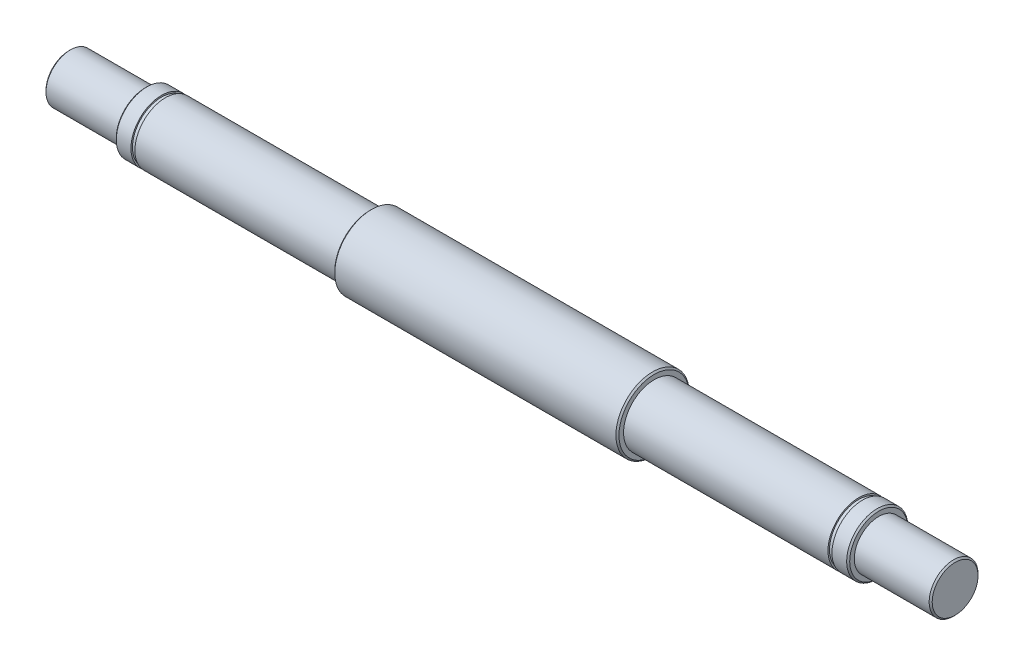
ISO-10303-21;
HEADER;
FILE_DESCRIPTION(('STEP AP214'),'2;1');
FILE_NAME('part.step','',(''),(''),'','','');
FILE_SCHEMA(('AUTOMOTIVE_DESIGN { 1 0 10303 214 1 1 1 1 }'));
ENDSEC;
DATA;
#1=APPLICATION_CONTEXT('core data for automotive mechanical design processes');
#2=APPLICATION_PROTOCOL_DEFINITION('international standard','automotive_design',2000,#1);
#3=PRODUCT_CONTEXT('',#1,'mechanical');
#4=PRODUCT('Part','Part','',(#3));
#5=PRODUCT_RELATED_PRODUCT_CATEGORY('part','',(#4));
#6=PRODUCT_DEFINITION_FORMATION('','',#4);
#7=PRODUCT_DEFINITION_CONTEXT('part definition',#1,'design');
#8=PRODUCT_DEFINITION('design','',#6,#7);
#9=PRODUCT_DEFINITION_SHAPE('','',#8);
#10=(LENGTH_UNIT() NAMED_UNIT(*) SI_UNIT(.MILLI.,.METRE.));
#11=(NAMED_UNIT(*) PLANE_ANGLE_UNIT() SI_UNIT($,.RADIAN.));
#12=(NAMED_UNIT(*) SI_UNIT($,.STERADIAN.) SOLID_ANGLE_UNIT());
#13=UNCERTAINTY_MEASURE_WITH_UNIT(LENGTH_MEASURE(1.E-05),#10,'distance_accuracy_value','');
#14=(GEOMETRIC_REPRESENTATION_CONTEXT(3) GLOBAL_UNCERTAINTY_ASSIGNED_CONTEXT((#13)) GLOBAL_UNIT_ASSIGNED_CONTEXT((#10,
#11,#12)) REPRESENTATION_CONTEXT('',''));
#15=CARTESIAN_POINT('',(0.,0.,0.));
#16=DIRECTION('',(0.,0.,1.));
#17=DIRECTION('',(1.,0.,0.));
#18=AXIS2_PLACEMENT_3D('',#15,#16,#17);
#19=CARTESIAN_POINT('',(145.,0.,0.));
#20=DIRECTION('',(-1.,0.,0.));
#21=DIRECTION('',(0.,0.,1.));
#22=AXIS2_PLACEMENT_3D('',#19,#20,#21);
#23=PLANE('',#22);
#24=CARTESIAN_POINT('',(145.,0.,0.));
#25=DIRECTION('',(-1.,0.,0.));
#26=DIRECTION('',(0.,0.,1.));
#27=AXIS2_PLACEMENT_3D('',#24,#25,#26);
#28=CIRCLE('',#27,7.49999999999992);
#29=CARTESIAN_POINT('',(145.,0.,7.49999999999992));
#30=VERTEX_POINT('',#29);
#31=EDGE_CURVE('E64',#30,#30,#28,.F.);
#32=ORIENTED_EDGE('',*,*,#31,.T.);
#33=EDGE_LOOP('',(#32));
#34=FACE_BOUND('',#33,.T.);
#35=ADVANCED_FACE('F32',(#34),#23,.F.);
#36=CARTESIAN_POINT('',(-145.,0.,0.));
#37=DIRECTION('',(-1.,0.,0.));
#38=DIRECTION('',(0.,0.,1.));
#39=AXIS2_PLACEMENT_3D('',#36,#37,#38);
#40=CYLINDRICAL_SURFACE('',#39,8.);
#41=CARTESIAN_POINT('',(144.5,0.,0.));
#42=DIRECTION('',(-1.,0.,0.));
#43=DIRECTION('',(0.,0.,1.));
#44=AXIS2_PLACEMENT_3D('',#41,#42,#43);
#45=CIRCLE('',#44,8.);
#46=CARTESIAN_POINT('',(144.5,0.,8.));
#47=VERTEX_POINT('',#46);
#48=EDGE_CURVE('E67',#47,#47,#45,.T.);
#49=ORIENTED_EDGE('',*,*,#48,.T.);
#50=EDGE_LOOP('',(#49));
#51=FACE_BOUND('',#50,.T.);
#52=CARTESIAN_POINT('',(120.,0.,0.));
#53=DIRECTION('',(-1.,0.,0.));
#54=DIRECTION('',(0.,0.,1.));
#55=AXIS2_PLACEMENT_3D('',#52,#53,#54);
#56=CIRCLE('',#55,8.);
#57=CARTESIAN_POINT('',(120.,0.,8.));
#58=VERTEX_POINT('',#57);
#59=EDGE_CURVE('E76',#58,#58,#56,.T.);
#60=ORIENTED_EDGE('',*,*,#59,.F.);
#61=EDGE_LOOP('',(#60));
#62=FACE_BOUND('',#61,.T.);
#63=ADVANCED_FACE('F130',(#51,#62),#40,.T.);
#64=CARTESIAN_POINT('',(120.,0.,-8.));
#65=DIRECTION('',(-1.,0.,0.));
#66=DIRECTION('',(0.,0.,1.));
#67=AXIS2_PLACEMENT_3D('',#64,#65,#66);
#68=PLANE('',#67);
#69=CARTESIAN_POINT('',(120.,0.,0.));
#70=DIRECTION('',(-1.,0.,0.));
#71=DIRECTION('',(0.,0.,1.));
#72=AXIS2_PLACEMENT_3D('',#69,#70,#71);
#73=CIRCLE('',#72,9.50000000000004);
#74=CARTESIAN_POINT('',(120.,0.,9.50000000000004));
#75=VERTEX_POINT('',#74);
#76=EDGE_CURVE('E70',#75,#75,#73,.F.);
#77=ORIENTED_EDGE('',*,*,#76,.T.);
#78=EDGE_LOOP('',(#77));
#79=FACE_BOUND('',#78,.T.);
#80=ORIENTED_EDGE('',*,*,#59,.T.);
#81=EDGE_LOOP('',(#80));
#82=FACE_BOUND('',#81,.T.);
#83=ADVANCED_FACE('F136',(#79,#82),#68,.F.);
#84=CARTESIAN_POINT('',(-145.,0.,0.));
#85=DIRECTION('',(-1.,0.,0.));
#86=DIRECTION('',(0.,0.,1.));
#87=AXIS2_PLACEMENT_3D('',#84,#85,#86);
#88=CYLINDRICAL_SURFACE('',#87,10.);
#89=CARTESIAN_POINT('',(119.5,0.,0.));
#90=DIRECTION('',(-1.,0.,0.));
#91=DIRECTION('',(0.,0.,1.));
#92=AXIS2_PLACEMENT_3D('',#89,#90,#91);
#93=CIRCLE('',#92,10.);
#94=CARTESIAN_POINT('',(119.5,0.,10.));
#95=VERTEX_POINT('',#94);
#96=EDGE_CURVE('E73',#95,#95,#93,.T.);
#97=ORIENTED_EDGE('',*,*,#96,.T.);
#98=EDGE_LOOP('',(#97));
#99=FACE_BOUND('',#98,.T.);
#100=CARTESIAN_POINT('',(114.7,0.,0.));
#101=DIRECTION('',(-1.,0.,0.));
#102=DIRECTION('',(0.,0.,1.));
#103=AXIS2_PLACEMENT_3D('',#100,#101,#102);
#104=CIRCLE('',#103,10.);
#105=CARTESIAN_POINT('',(114.7,0.,10.));
#106=VERTEX_POINT('',#105);
#107=EDGE_CURVE('E79',#106,#106,#104,.T.);
#108=ORIENTED_EDGE('',*,*,#107,.F.);
#109=EDGE_LOOP('',(#108));
#110=FACE_BOUND('',#109,.T.);
#111=ADVANCED_FACE('F222',(#99,#110),#88,.T.);
#112=CARTESIAN_POINT('',(114.7,0.,-10.));
#113=DIRECTION('',(1.,0.,0.));
#114=DIRECTION('',(0.,0.,-1.));
#115=AXIS2_PLACEMENT_3D('',#112,#113,#114);
#116=PLANE('',#115);
#117=CARTESIAN_POINT('',(114.7,0.,0.));
#118=DIRECTION('',(-1.,0.,0.));
#119=DIRECTION('',(0.,0.,1.));
#120=AXIS2_PLACEMENT_3D('',#117,#118,#119);
#121=CIRCLE('',#120,9.5);
#122=CARTESIAN_POINT('',(114.7,0.,9.5));
#123=VERTEX_POINT('',#122);
#124=EDGE_CURVE('E82',#123,#123,#121,.T.);
#125=ORIENTED_EDGE('',*,*,#124,.F.);
#126=EDGE_LOOP('',(#125));
#127=FACE_BOUND('',#126,.T.);
#128=ORIENTED_EDGE('',*,*,#107,.T.);
#129=EDGE_LOOP('',(#128));
#130=FACE_BOUND('',#129,.T.);
#131=ADVANCED_FACE('F218',(#127,#130),#116,.F.);
#132=CARTESIAN_POINT('',(-145.,0.,0.));
#133=DIRECTION('',(-1.,0.,0.));
#134=DIRECTION('',(0.,0.,1.));
#135=AXIS2_PLACEMENT_3D('',#132,#133,#134);
#136=CYLINDRICAL_SURFACE('',#135,9.5);
#137=CARTESIAN_POINT('',(113.4,0.,0.));
#138=DIRECTION('',(-1.,0.,0.));
#139=DIRECTION('',(0.,0.,1.));
#140=AXIS2_PLACEMENT_3D('',#137,#138,#139);
#141=CIRCLE('',#140,9.5);
#142=CARTESIAN_POINT('',(113.4,0.,9.5));
#143=VERTEX_POINT('',#142);
#144=EDGE_CURVE('E85',#143,#143,#141,.T.);
#145=ORIENTED_EDGE('',*,*,#144,.F.);
#146=EDGE_LOOP('',(#145));
#147=FACE_BOUND('',#146,.T.);
#148=ORIENTED_EDGE('',*,*,#124,.T.);
#149=EDGE_LOOP('',(#148));
#150=FACE_BOUND('',#149,.T.);
#151=ADVANCED_FACE('F214',(#147,#150),#136,.T.);
#152=CARTESIAN_POINT('',(113.4,0.,-9.5));
#153=DIRECTION('',(-1.,0.,0.));
#154=DIRECTION('',(0.,0.,1.));
#155=AXIS2_PLACEMENT_3D('',#152,#153,#154);
#156=PLANE('',#155);
#157=CARTESIAN_POINT('',(113.4,0.,0.));
#158=DIRECTION('',(-1.,0.,0.));
#159=DIRECTION('',(0.,0.,1.));
#160=AXIS2_PLACEMENT_3D('',#157,#158,#159);
#161=CIRCLE('',#160,10.);
#162=CARTESIAN_POINT('',(113.4,0.,10.));
#163=VERTEX_POINT('',#162);
#164=EDGE_CURVE('E88',#163,#163,#161,.T.);
#165=ORIENTED_EDGE('',*,*,#164,.F.);
#166=EDGE_LOOP('',(#165));
#167=FACE_BOUND('',#166,.T.);
#168=ORIENTED_EDGE('',*,*,#144,.T.);
#169=EDGE_LOOP('',(#168));
#170=FACE_BOUND('',#169,.T.);
#171=ADVANCED_FACE('F210',(#167,#170),#156,.F.);
#172=CARTESIAN_POINT('',(-145.,0.,0.));
#173=DIRECTION('',(-1.,0.,0.));
#174=DIRECTION('',(0.,0.,1.));
#175=AXIS2_PLACEMENT_3D('',#172,#173,#174);
#176=CYLINDRICAL_SURFACE('',#175,10.);
#177=CARTESIAN_POINT('',(46.5,0.,0.));
#178=DIRECTION('',(-1.,0.,0.));
#179=DIRECTION('',(0.,0.,1.));
#180=AXIS2_PLACEMENT_3D('',#177,#178,#179);
#181=CIRCLE('',#180,10.);
#182=CARTESIAN_POINT('',(46.5,0.,10.));
#183=VERTEX_POINT('',#182);
#184=EDGE_CURVE('E91',#183,#183,#181,.T.);
#185=ORIENTED_EDGE('',*,*,#184,.F.);
#186=EDGE_LOOP('',(#185));
#187=FACE_BOUND('',#186,.T.);
#188=ORIENTED_EDGE('',*,*,#164,.T.);
#189=EDGE_LOOP('',(#188));
#190=FACE_BOUND('',#189,.T.);
#191=ADVANCED_FACE('F206',(#187,#190),#176,.T.);
#192=CARTESIAN_POINT('',(46.5,0.,-10.));
#193=DIRECTION('',(-1.,0.,0.));
#194=DIRECTION('',(0.,0.,1.));
#195=AXIS2_PLACEMENT_3D('',#192,#193,#194);
#196=PLANE('',#195);
#197=CARTESIAN_POINT('',(46.5,0.,0.));
#198=DIRECTION('',(-1.,0.,0.));
#199=DIRECTION('',(0.,0.,1.));
#200=AXIS2_PLACEMENT_3D('',#197,#198,#199);
#201=CIRCLE('',#200,11.5);
#202=CARTESIAN_POINT('',(46.5,0.,11.5));
#203=VERTEX_POINT('',#202);
#204=EDGE_CURVE('E55',#203,#203,#201,.F.);
#205=ORIENTED_EDGE('',*,*,#204,.T.);
#206=EDGE_LOOP('',(#205));
#207=FACE_BOUND('',#206,.T.);
#208=ORIENTED_EDGE('',*,*,#184,.T.);
#209=EDGE_LOOP('',(#208));
#210=FACE_BOUND('',#209,.T.);
#211=ADVANCED_FACE('F200',(#207,#210),#196,.F.);
#212=CARTESIAN_POINT('',(-145.,0.,0.));
#213=DIRECTION('',(-1.,0.,0.));
#214=DIRECTION('',(0.,0.,1.));
#215=AXIS2_PLACEMENT_3D('',#212,#213,#214);
#216=CYLINDRICAL_SURFACE('',#215,12.);
#217=CARTESIAN_POINT('',(46.,0.,0.));
#218=DIRECTION('',(-1.,0.,0.));
#219=DIRECTION('',(0.,0.,1.));
#220=AXIS2_PLACEMENT_3D('',#217,#218,#219);
#221=CIRCLE('',#220,12.);
#222=CARTESIAN_POINT('',(46.,0.,12.));
#223=VERTEX_POINT('',#222);
#224=EDGE_CURVE('E58',#223,#223,#221,.T.);
#225=ORIENTED_EDGE('',*,*,#224,.T.);
#226=EDGE_LOOP('',(#225));
#227=FACE_BOUND('',#226,.T.);
#228=CARTESIAN_POINT('',(-46.0000000000001,0.,0.));
#229=DIRECTION('',(1.,0.,0.));
#230=DIRECTION('',(0.,0.,-1.));
#231=AXIS2_PLACEMENT_3D('',#228,#229,#230);
#232=CIRCLE('',#231,12.);
#233=CARTESIAN_POINT('',(-46.0000000000001,0.,-12.));
#234=VERTEX_POINT('',#233);
#235=EDGE_CURVE('E61',#234,#234,#232,.T.);
#236=ORIENTED_EDGE('',*,*,#235,.T.);
#237=EDGE_LOOP('',(#236));
#238=FACE_BOUND('',#237,.T.);
#239=ADVANCED_FACE('F194',(#227,#238),#216,.T.);
#240=CARTESIAN_POINT('',(-46.5,0.,-10.));
#241=DIRECTION('',(1.,0.,0.));
#242=DIRECTION('',(0.,0.,-1.));
#243=AXIS2_PLACEMENT_3D('',#240,#241,#242);
#244=PLANE('',#243);
#245=CARTESIAN_POINT('',(-46.5,0.,0.));
#246=DIRECTION('',(1.,0.,0.));
#247=DIRECTION('',(0.,0.,-1.));
#248=AXIS2_PLACEMENT_3D('',#245,#246,#247);
#249=CIRCLE('',#248,11.5000000000001);
#250=CARTESIAN_POINT('',(-46.5,0.,-11.5000000000001));
#251=VERTEX_POINT('',#250);
#252=EDGE_CURVE('E52',#251,#251,#249,.F.);
#253=ORIENTED_EDGE('',*,*,#252,.T.);
#254=EDGE_LOOP('',(#253));
#255=FACE_BOUND('',#254,.T.);
#256=CARTESIAN_POINT('',(-46.5,0.,0.));
#257=DIRECTION('',(-1.,0.,0.));
#258=DIRECTION('',(0.,0.,1.));
#259=AXIS2_PLACEMENT_3D('',#256,#257,#258);
#260=CIRCLE('',#259,10.);
#261=CARTESIAN_POINT('',(-46.5,0.,10.));
#262=VERTEX_POINT('',#261);
#263=EDGE_CURVE('E94',#262,#262,#260,.T.);
#264=ORIENTED_EDGE('',*,*,#263,.F.);
#265=EDGE_LOOP('',(#264));
#266=FACE_BOUND('',#265,.T.);
#267=ADVANCED_FACE('F189',(#255,#266),#244,.F.);
#268=CARTESIAN_POINT('',(-145.,0.,0.));
#269=DIRECTION('',(-1.,0.,0.));
#270=DIRECTION('',(0.,0.,1.));
#271=AXIS2_PLACEMENT_3D('',#268,#269,#270);
#272=CYLINDRICAL_SURFACE('',#271,10.);
#273=CARTESIAN_POINT('',(-113.4,0.,0.));
#274=DIRECTION('',(-1.,0.,0.));
#275=DIRECTION('',(0.,0.,1.));
#276=AXIS2_PLACEMENT_3D('',#273,#274,#275);
#277=CIRCLE('',#276,10.);
#278=CARTESIAN_POINT('',(-113.4,0.,10.));
#279=VERTEX_POINT('',#278);
#280=EDGE_CURVE('E97',#279,#279,#277,.T.);
#281=ORIENTED_EDGE('',*,*,#280,.F.);
#282=EDGE_LOOP('',(#281));
#283=FACE_BOUND('',#282,.T.);
#284=ORIENTED_EDGE('',*,*,#263,.T.);
#285=EDGE_LOOP('',(#284));
#286=FACE_BOUND('',#285,.T.);
#287=ADVANCED_FACE('F183',(#283,#286),#272,.T.);
#288=CARTESIAN_POINT('',(-113.4,0.,-9.5));
#289=DIRECTION('',(1.,0.,0.));
#290=DIRECTION('',(0.,0.,-1.));
#291=AXIS2_PLACEMENT_3D('',#288,#289,#290);
#292=PLANE('',#291);
#293=CARTESIAN_POINT('',(-113.4,0.,0.));
#294=DIRECTION('',(-1.,0.,0.));
#295=DIRECTION('',(0.,0.,1.));
#296=AXIS2_PLACEMENT_3D('',#293,#294,#295);
#297=CIRCLE('',#296,9.5);
#298=CARTESIAN_POINT('',(-113.4,0.,9.5));
#299=VERTEX_POINT('',#298);
#300=EDGE_CURVE('E100',#299,#299,#297,.T.);
#301=ORIENTED_EDGE('',*,*,#300,.F.);
#302=EDGE_LOOP('',(#301));
#303=FACE_BOUND('',#302,.T.);
#304=ORIENTED_EDGE('',*,*,#280,.T.);
#305=EDGE_LOOP('',(#304));
#306=FACE_BOUND('',#305,.T.);
#307=ADVANCED_FACE('F177',(#303,#306),#292,.F.);
#308=CARTESIAN_POINT('',(-145.,0.,0.));
#309=DIRECTION('',(-1.,0.,0.));
#310=DIRECTION('',(0.,0.,1.));
#311=AXIS2_PLACEMENT_3D('',#308,#309,#310);
#312=CYLINDRICAL_SURFACE('',#311,9.5);
#313=CARTESIAN_POINT('',(-114.7,0.,0.));
#314=DIRECTION('',(-1.,0.,0.));
#315=DIRECTION('',(0.,0.,1.));
#316=AXIS2_PLACEMENT_3D('',#313,#314,#315);
#317=CIRCLE('',#316,9.5);
#318=CARTESIAN_POINT('',(-114.7,0.,9.5));
#319=VERTEX_POINT('',#318);
#320=EDGE_CURVE('E103',#319,#319,#317,.T.);
#321=ORIENTED_EDGE('',*,*,#320,.F.);
#322=EDGE_LOOP('',(#321));
#323=FACE_BOUND('',#322,.T.);
#324=ORIENTED_EDGE('',*,*,#300,.T.);
#325=EDGE_LOOP('',(#324));
#326=FACE_BOUND('',#325,.T.);
#327=ADVANCED_FACE('F171',(#323,#326),#312,.T.);
#328=CARTESIAN_POINT('',(-114.7,0.,-10.));
#329=DIRECTION('',(-1.,0.,0.));
#330=DIRECTION('',(0.,0.,1.));
#331=AXIS2_PLACEMENT_3D('',#328,#329,#330);
#332=PLANE('',#331);
#333=CARTESIAN_POINT('',(-114.7,0.,0.));
#334=DIRECTION('',(-1.,0.,0.));
#335=DIRECTION('',(0.,0.,1.));
#336=AXIS2_PLACEMENT_3D('',#333,#334,#335);
#337=CIRCLE('',#336,10.);
#338=CARTESIAN_POINT('',(-114.7,0.,10.));
#339=VERTEX_POINT('',#338);
#340=EDGE_CURVE('E106',#339,#339,#337,.T.);
#341=ORIENTED_EDGE('',*,*,#340,.F.);
#342=EDGE_LOOP('',(#341));
#343=FACE_BOUND('',#342,.T.);
#344=ORIENTED_EDGE('',*,*,#320,.T.);
#345=EDGE_LOOP('',(#344));
#346=FACE_BOUND('',#345,.T.);
#347=ADVANCED_FACE('F126',(#343,#346),#332,.F.);
#348=CARTESIAN_POINT('',(-145.,0.,0.));
#349=DIRECTION('',(-1.,0.,0.));
#350=DIRECTION('',(0.,0.,1.));
#351=AXIS2_PLACEMENT_3D('',#348,#349,#350);
#352=CYLINDRICAL_SURFACE('',#351,10.);
#353=CARTESIAN_POINT('',(-119.5,0.,0.));
#354=DIRECTION('',(1.,0.,0.));
#355=DIRECTION('',(0.,0.,-1.));
#356=AXIS2_PLACEMENT_3D('',#353,#354,#355);
#357=CIRCLE('',#356,10.);
#358=CARTESIAN_POINT('',(-119.5,0.,-10.));
#359=VERTEX_POINT('',#358);
#360=EDGE_CURVE('E43',#359,#359,#357,.T.);
#361=ORIENTED_EDGE('',*,*,#360,.T.);
#362=EDGE_LOOP('',(#361));
#363=FACE_BOUND('',#362,.T.);
#364=ORIENTED_EDGE('',*,*,#340,.T.);
#365=EDGE_LOOP('',(#364));
#366=FACE_BOUND('',#365,.T.);
#367=ADVANCED_FACE('F117',(#363,#366),#352,.T.);
#368=CARTESIAN_POINT('',(-120.,0.,-8.));
#369=DIRECTION('',(1.,0.,0.));
#370=DIRECTION('',(0.,0.,-1.));
#371=AXIS2_PLACEMENT_3D('',#368,#369,#370);
#372=PLANE('',#371);
#373=CARTESIAN_POINT('',(-120.,0.,0.));
#374=DIRECTION('',(1.,0.,0.));
#375=DIRECTION('',(0.,0.,-1.));
#376=AXIS2_PLACEMENT_3D('',#373,#374,#375);
#377=CIRCLE('',#376,9.50000000000009);
#378=CARTESIAN_POINT('',(-120.,0.,-9.50000000000009));
#379=VERTEX_POINT('',#378);
#380=EDGE_CURVE('E47',#379,#379,#377,.F.);
#381=ORIENTED_EDGE('',*,*,#380,.T.);
#382=EDGE_LOOP('',(#381));
#383=FACE_BOUND('',#382,.T.);
#384=CARTESIAN_POINT('',(-120.,0.,0.));
#385=DIRECTION('',(-1.,0.,0.));
#386=DIRECTION('',(0.,0.,1.));
#387=AXIS2_PLACEMENT_3D('',#384,#385,#386);
#388=CIRCLE('',#387,8.);
#389=CARTESIAN_POINT('',(-120.,0.,8.));
#390=VERTEX_POINT('',#389);
#391=EDGE_CURVE('E109',#390,#390,#388,.T.);
#392=ORIENTED_EDGE('',*,*,#391,.F.);
#393=EDGE_LOOP('',(#392));
#394=FACE_BOUND('',#393,.T.);
#395=ADVANCED_FACE('F115',(#383,#394),#372,.F.);
#396=CARTESIAN_POINT('',(-145.,0.,0.));
#397=DIRECTION('',(-1.,0.,0.));
#398=DIRECTION('',(0.,0.,1.));
#399=AXIS2_PLACEMENT_3D('',#396,#397,#398);
#400=CYLINDRICAL_SURFACE('',#399,8.);
#401=CARTESIAN_POINT('',(-144.5,0.,0.));
#402=DIRECTION('',(1.,0.,0.));
#403=DIRECTION('',(0.,0.,-1.));
#404=AXIS2_PLACEMENT_3D('',#401,#402,#403);
#405=CIRCLE('',#404,8.);
#406=CARTESIAN_POINT('',(-144.5,0.,-8.));
#407=VERTEX_POINT('',#406);
#408=EDGE_CURVE('E10',#407,#407,#405,.T.);
#409=ORIENTED_EDGE('',*,*,#408,.T.);
#410=EDGE_LOOP('',(#409));
#411=FACE_BOUND('',#410,.T.);
#412=ORIENTED_EDGE('',*,*,#391,.T.);
#413=EDGE_LOOP('',(#412));
#414=FACE_BOUND('',#413,.T.);
#415=ADVANCED_FACE('F113',(#411,#414),#400,.T.);
#416=CARTESIAN_POINT('',(-145.,0.,0.));
#417=DIRECTION('',(1.,0.,0.));
#418=DIRECTION('',(0.,0.,-1.));
#419=AXIS2_PLACEMENT_3D('',#416,#417,#418);
#420=PLANE('',#419);
#421=CARTESIAN_POINT('',(-145.,0.,0.));
#422=DIRECTION('',(1.,0.,0.));
#423=DIRECTION('',(0.,0.,-1.));
#424=AXIS2_PLACEMENT_3D('',#421,#422,#423);
#425=CIRCLE('',#424,7.49999999999998);
#426=CARTESIAN_POINT('',(-145.,0.,-7.49999999999998));
#427=VERTEX_POINT('',#426);
#428=EDGE_CURVE('E39',#427,#427,#425,.F.);
#429=ORIENTED_EDGE('',*,*,#428,.T.);
#430=EDGE_LOOP('',(#429));
#431=FACE_BOUND('',#430,.T.);
#432=ADVANCED_FACE('F124',(#431),#420,.F.);
#433=CARTESIAN_POINT('',(119.5,0.,0.));
#434=DIRECTION('',(-1.,0.,0.));
#435=DIRECTION('',(0.,0.,1.));
#436=AXIS2_PLACEMENT_3D('',#433,#434,#435);
#437=CONICAL_SURFACE('',#436,10.,0.78539816339744);
#438=ORIENTED_EDGE('',*,*,#76,.F.);
#439=EDGE_LOOP('',(#438));
#440=FACE_BOUND('',#439,.T.);
#441=ORIENTED_EDGE('',*,*,#96,.F.);
#442=EDGE_LOOP('',(#441));
#443=FACE_BOUND('',#442,.T.);
#444=ADVANCED_FACE('F141',(#440,#443),#437,.T.);
#445=CARTESIAN_POINT('',(144.5,0.,0.));
#446=DIRECTION('',(-1.,0.,0.));
#447=DIRECTION('',(0.,0.,1.));
#448=AXIS2_PLACEMENT_3D('',#445,#446,#447);
#449=CONICAL_SURFACE('',#448,8.,0.785398163397469);
#450=ORIENTED_EDGE('',*,*,#31,.F.);
#451=EDGE_LOOP('',(#450));
#452=FACE_BOUND('',#451,.T.);
#453=ORIENTED_EDGE('',*,*,#48,.F.);
#454=EDGE_LOOP('',(#453));
#455=FACE_BOUND('',#454,.T.);
#456=ADVANCED_FACE('F144',(#452,#455),#449,.T.);
#457=CARTESIAN_POINT('',(46.,0.,0.));
#458=DIRECTION('',(-1.,0.,0.));
#459=DIRECTION('',(0.,0.,1.));
#460=AXIS2_PLACEMENT_3D('',#457,#458,#459);
#461=CONICAL_SURFACE('',#460,12.,0.785398163397412);
#462=ORIENTED_EDGE('',*,*,#204,.F.);
#463=EDGE_LOOP('',(#462));
#464=FACE_BOUND('',#463,.T.);
#465=ORIENTED_EDGE('',*,*,#224,.F.);
#466=EDGE_LOOP('',(#465));
#467=FACE_BOUND('',#466,.T.);
#468=ADVANCED_FACE('F148',(#464,#467),#461,.T.);
#469=CARTESIAN_POINT('',(-46.5,0.,0.));
#470=DIRECTION('',(1.,0.,0.));
#471=DIRECTION('',(0.,0.,-1.));
#472=AXIS2_PLACEMENT_3D('',#469,#470,#471);
#473=CONICAL_SURFACE('',#472,11.5000000000001,0.785398163397426);
#474=ORIENTED_EDGE('',*,*,#235,.F.);
#475=EDGE_LOOP('',(#474));
#476=FACE_BOUND('',#475,.T.);
#477=ORIENTED_EDGE('',*,*,#252,.F.);
#478=EDGE_LOOP('',(#477));
#479=FACE_BOUND('',#478,.T.);
#480=ADVANCED_FACE('F152',(#476,#479),#473,.T.);
#481=CARTESIAN_POINT('',(-120.,0.,0.));
#482=DIRECTION('',(1.,0.,0.));
#483=DIRECTION('',(0.,0.,-1.));
#484=AXIS2_PLACEMENT_3D('',#481,#482,#483);
#485=CONICAL_SURFACE('',#484,9.50000000000009,0.78539816339744);
#486=ORIENTED_EDGE('',*,*,#360,.F.);
#487=EDGE_LOOP('',(#486));
#488=FACE_BOUND('',#487,.T.);
#489=ORIENTED_EDGE('',*,*,#380,.F.);
#490=EDGE_LOOP('',(#489));
#491=FACE_BOUND('',#490,.T.);
#492=ADVANCED_FACE('F155',(#488,#491),#485,.T.);
#493=CARTESIAN_POINT('',(-145.,0.,0.));
#494=DIRECTION('',(1.,0.,0.));
#495=DIRECTION('',(0.,0.,-1.));
#496=AXIS2_PLACEMENT_3D('',#493,#494,#495);
#497=CONICAL_SURFACE('',#496,7.49999999999998,0.785398163397441);
#498=ORIENTED_EDGE('',*,*,#408,.F.);
#499=EDGE_LOOP('',(#498));
#500=FACE_BOUND('',#499,.T.);
#501=ORIENTED_EDGE('',*,*,#428,.F.);
#502=EDGE_LOOP('',(#501));
#503=FACE_BOUND('',#502,.T.);
#504=ADVANCED_FACE('F34',(#500,#503),#497,.T.);
#505=CLOSED_SHELL('',(#35,#63,#83,#111,#131,#151,#171,#191,#211,#239,#267,#287,#307,#327,#347,
#367,#395,#415,#432,#444,#456,#468,#480,#492,#504));
#506=MANIFOLD_SOLID_BREP('B2',#505);
#507=ADVANCED_BREP_SHAPE_REPRESENTATION('',(#18,#506),#14);
#508=SHAPE_DEFINITION_REPRESENTATION(#9,#507);
ENDSEC;
END-ISO-10303-21;
